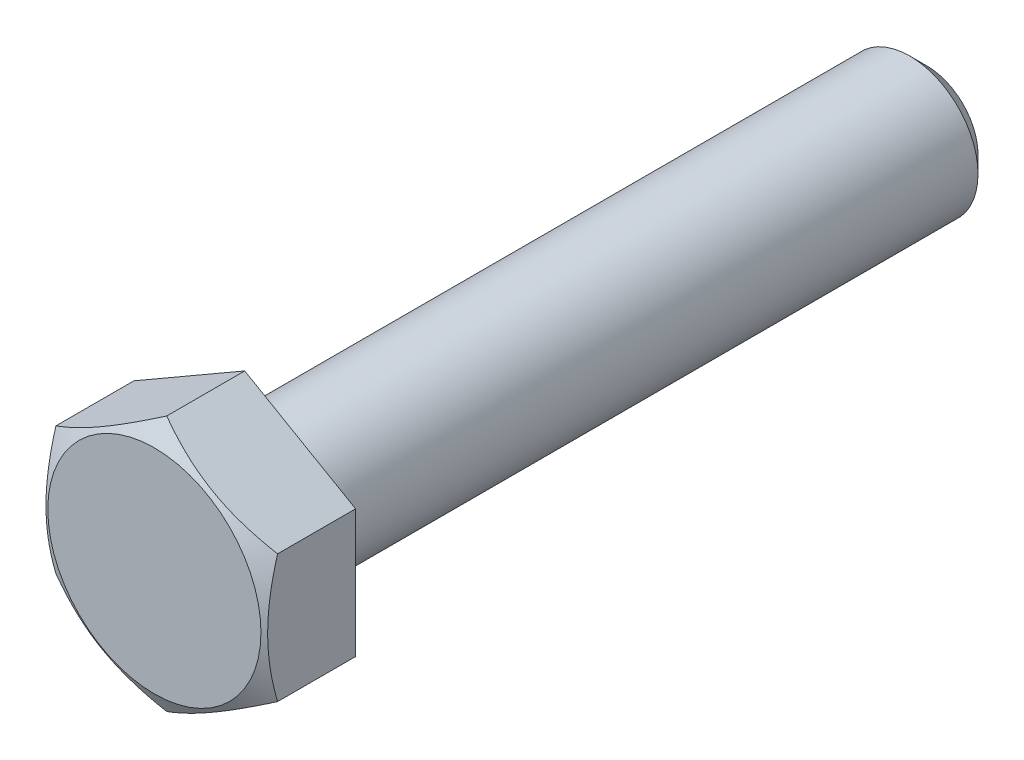
ISO-10303-21;
HEADER;
FILE_DESCRIPTION(('STEP AP214'),'2;1');
FILE_NAME('part.step','',(''),(''),'','','');
FILE_SCHEMA(('AUTOMOTIVE_DESIGN { 1 0 10303 214 1 1 1 1 }'));
ENDSEC;
DATA;
#1=APPLICATION_CONTEXT('core data for automotive mechanical design processes');
#2=APPLICATION_PROTOCOL_DEFINITION('international standard','automotive_design',2000,#1);
#3=PRODUCT_CONTEXT('',#1,'mechanical');
#4=PRODUCT('Part','Part','',(#3));
#5=PRODUCT_RELATED_PRODUCT_CATEGORY('part','',(#4));
#6=PRODUCT_DEFINITION_FORMATION('','',#4);
#7=PRODUCT_DEFINITION_CONTEXT('part definition',#1,'design');
#8=PRODUCT_DEFINITION('design','',#6,#7);
#9=PRODUCT_DEFINITION_SHAPE('','',#8);
#10=(LENGTH_UNIT() NAMED_UNIT(*) SI_UNIT(.MILLI.,.METRE.));
#11=(NAMED_UNIT(*) PLANE_ANGLE_UNIT() SI_UNIT($,.RADIAN.));
#12=(NAMED_UNIT(*) SI_UNIT($,.STERADIAN.) SOLID_ANGLE_UNIT());
#13=UNCERTAINTY_MEASURE_WITH_UNIT(LENGTH_MEASURE(1.E-05),#10,'distance_accuracy_value','');
#14=(GEOMETRIC_REPRESENTATION_CONTEXT(3) GLOBAL_UNCERTAINTY_ASSIGNED_CONTEXT((#13)) GLOBAL_UNIT_ASSIGNED_CONTEXT((#10,
#11,#12)) REPRESENTATION_CONTEXT('',''));
#15=CARTESIAN_POINT('',(0.,0.,0.));
#16=DIRECTION('',(0.,0.,1.));
#17=DIRECTION('',(1.,0.,0.));
#18=AXIS2_PLACEMENT_3D('',#15,#16,#17);
#19=CARTESIAN_POINT('',(6.5,3.75277674973257,5.3));
#20=DIRECTION('',(-0.5,-0.866025403784439,0.));
#21=DIRECTION('',(0.866025403784439,-0.5,0.));
#22=AXIS2_PLACEMENT_3D('',#19,#20,#21);
#23=PLANE('',#22);
#24=CARTESIAN_POINT('',(6.5002,3.75266127967873,4.57503918089673));
#25=CARTESIAN_POINT('',(6.35732254094112,3.8351516191275,4.62265800962711));
#26=CARTESIAN_POINT('',(6.21391236546508,3.91794952254312,4.66811573209989));
#27=CARTESIAN_POINT('',(5.9259273686828,4.08421773795795,4.75411375067955));
#28=CARTESIAN_POINT('',(5.78135207342873,4.16768832359105,4.79465192547457));
#29=CARTESIAN_POINT('',(5.34531134947996,4.41943655294051,4.90809143157939));
#30=CARTESIAN_POINT('',(5.05212471715368,4.5887079340369,4.97261462557386));
#31=CARTESIAN_POINT('',(4.61337625445562,4.84201947708215,5.0482758491551));
#32=CARTESIAN_POINT('',(4.46912536350531,4.92530276780316,5.06982957624561));
#33=CARTESIAN_POINT('',(4.17997178286191,5.09224566542477,5.10597211809648));
#34=CARTESIAN_POINT('',(4.03506915190111,5.17590523841627,5.12056154824293));
#35=CARTESIAN_POINT('',(3.74501222057168,5.34336968579964,5.14240368019525));
#36=CARTESIAN_POINT('',(3.59985839394579,5.427174286676,5.14966470838049));
#37=CARTESIAN_POINT('',(3.30942466302505,5.59485627940484,5.15670213012036));
#38=CARTESIAN_POINT('',(3.16414476276364,5.6787336689286,5.15647875489039));
#39=CARTESIAN_POINT('',(2.7661240575735,5.90853103021317,5.14557897418743));
#40=CARTESIAN_POINT('',(2.51351353897243,6.05437578112763,5.12728061483318));
#41=CARTESIAN_POINT('',(2.00997032176432,6.34509659313135,5.06925609124492));
#42=CARTESIAN_POINT('',(1.75903939406691,6.48997163178544,5.02951009416435));
#43=CARTESIAN_POINT('',(1.25448277935568,6.78127752911038,4.93015652950044));
#44=CARTESIAN_POINT('',(1.00092075856408,6.92767163007067,4.87012800706457));
#45=CARTESIAN_POINT('',(0.497578064240953,7.21827667013277,4.73388744019273));
#46=CARTESIAN_POINT('',(0.247790944447035,7.36249133098589,4.657707398539));
#47=CARTESIAN_POINT('',(-0.000200000000000559,7.50566896951897,4.57503918089673));
#48=B_SPLINE_CURVE_WITH_KNOTS('',3,(#24,#25,#26,#27,#28,#29,#30,#31,#32,#33,#34,#35,#36,#37,#38,
#39,#40,#41,#42,#43,#44,#45,#46,#47),.UNSPECIFIED.,.F.,.F.,(4,2,2,2,2,2,2,2,2,2,2,4),(0.,
0.515105052395587,1.03043143507524,2.06322554824262,2.56697389547996,3.07067772176454,
3.57380860368928,4.0769239424252,4.9527935470566,5.82947446853466,6.72559912449736,
7.61996451221045),.UNSPECIFIED.);
#49=CARTESIAN_POINT('',(6.5,3.75277674973257,4.57510584910183));
#50=VERTEX_POINT('',#49);
#51=CARTESIAN_POINT('',(0.,7.50555349946513,4.57510584910183));
#52=VERTEX_POINT('',#51);
#53=EDGE_CURVE('E94',#50,#52,#48,.T.);
#54=ORIENTED_EDGE('',*,*,#53,.F.);
#55=DIRECTION('',(0.,0.,-1.));
#56=VECTOR('',#55,1.);
#57=CARTESIAN_POINT('',(6.5,3.75277674973257,5.3));
#58=LINE('',#57,#56);
#59=CARTESIAN_POINT('',(6.5,3.75277674973257,0.));
#60=VERTEX_POINT('',#59);
#61=EDGE_CURVE('E63',#50,#60,#58,.T.);
#62=ORIENTED_EDGE('',*,*,#61,.T.);
#63=DIRECTION('',(-0.866025403784439,0.5,0.));
#64=VECTOR('',#63,1.);
#65=CARTESIAN_POINT('',(6.5,3.75277674973257,0.));
#66=LINE('',#65,#64);
#67=CARTESIAN_POINT('',(0.,7.50555349946513,0.));
#68=VERTEX_POINT('',#67);
#69=EDGE_CURVE('E102',#60,#68,#66,.T.);
#70=ORIENTED_EDGE('',*,*,#69,.T.);
#71=DIRECTION('',(0.,0.,-1.));
#72=VECTOR('',#71,1.);
#73=CARTESIAN_POINT('',(0.,7.50555349946513,5.3));
#74=LINE('',#73,#72);
#75=EDGE_CURVE('E101',#52,#68,#74,.T.);
#76=ORIENTED_EDGE('',*,*,#75,.F.);
#77=EDGE_LOOP('',(#54,#62,#70,#76));
#78=FACE_BOUND('',#77,.T.);
#79=ADVANCED_FACE('F40',(#78),#23,.F.);
#80=CARTESIAN_POINT('',(0.,7.50555349946513,5.3));
#81=DIRECTION('',(0.5,-0.866025403784439,0.));
#82=DIRECTION('',(0.866025403784439,0.5,0.));
#83=AXIS2_PLACEMENT_3D('',#80,#81,#82);
#84=PLANE('',#83);
#85=CARTESIAN_POINT('',(0.000199999999999772,7.50566896951897,4.57503918089673));
#86=CARTESIAN_POINT('',(-0.142677459058881,7.4231786300702,4.62265800962711));
#87=CARTESIAN_POINT('',(-0.286087634534913,7.34038072665458,4.66811573209989));
#88=CARTESIAN_POINT('',(-0.574072631317195,7.17411251123976,4.75411375067955));
#89=CARTESIAN_POINT('',(-0.718647926571264,7.09064192560665,4.79465192547457));
#90=CARTESIAN_POINT('',(-1.15468865052003,6.83889369625719,4.90809143157939));
#91=CARTESIAN_POINT('',(-1.44787528284632,6.66962231516081,4.97261462557386));
#92=CARTESIAN_POINT('',(-1.88662374554437,6.41631077211555,5.0482758491551));
#93=CARTESIAN_POINT('',(-2.03087463649469,6.33302748139454,5.06982957624561));
#94=CARTESIAN_POINT('',(-2.32002821713809,6.16608458377293,5.10597211809648));
#95=CARTESIAN_POINT('',(-2.46493084809889,6.08242501078143,5.12056154824293));
#96=CARTESIAN_POINT('',(-2.75498777942832,5.91496056339806,5.14240368019525));
#97=CARTESIAN_POINT('',(-2.90014160605421,5.8311559625217,5.14966470838049));
#98=CARTESIAN_POINT('',(-3.19057533697495,5.66347396979287,5.15670213012036));
#99=CARTESIAN_POINT('',(-3.33585523723636,5.5795965802691,5.15647875489039));
#100=CARTESIAN_POINT('',(-3.73387594242649,5.34979921898453,5.14557897418743));
#101=CARTESIAN_POINT('',(-3.98648646102757,5.20395446807007,5.12728061483318));
#102=CARTESIAN_POINT('',(-4.49002967823568,4.91323365606636,5.06925609124492));
#103=CARTESIAN_POINT('',(-4.74096060593308,4.76835861741226,5.02951009416435));
#104=CARTESIAN_POINT('',(-5.24551722064432,4.47705272008732,4.93015652950044));
#105=CARTESIAN_POINT('',(-5.49907924143591,4.33065861912703,4.87012800706457));
#106=CARTESIAN_POINT('',(-6.00242193575904,4.04005357906494,4.73388744019273));
#107=CARTESIAN_POINT('',(-6.25220905555296,3.89583891821182,4.657707398539));
#108=CARTESIAN_POINT('',(-6.5002,3.75266127967873,4.57503918089673));
#109=B_SPLINE_CURVE_WITH_KNOTS('',3,(#85,#86,#87,#88,#89,#90,#91,#92,#93,#94,#95,#96,#97,#98,
#99,#100,#101,#102,#103,#104,#105,#106,#107,#108),.UNSPECIFIED.,.F.,.F.,(4,2,2,2,2,2,2,2,2,2,2,
4),(0.,0.515105052395588,1.03043143507524,2.06322554824262,2.56697389547996,3.07067772176454,
3.57380860368928,4.0769239424252,4.9527935470566,5.82947446853466,6.72559912449736,
7.61996451221046),.UNSPECIFIED.);
#110=CARTESIAN_POINT('',(-6.5,3.75277674973257,4.57510584910183));
#111=VERTEX_POINT('',#110);
#112=EDGE_CURVE('E103',#52,#111,#109,.T.);
#113=ORIENTED_EDGE('',*,*,#112,.F.);
#114=ORIENTED_EDGE('',*,*,#75,.T.);
#115=DIRECTION('',(-0.866025403784439,-0.5,0.));
#116=VECTOR('',#115,1.);
#117=CARTESIAN_POINT('',(0.,7.50555349946513,0.));
#118=LINE('',#117,#116);
#119=CARTESIAN_POINT('',(-6.5,3.75277674973257,0.));
#120=VERTEX_POINT('',#119);
#121=EDGE_CURVE('E222',#68,#120,#118,.T.);
#122=ORIENTED_EDGE('',*,*,#121,.T.);
#123=DIRECTION('',(0.,0.,-1.));
#124=VECTOR('',#123,1.);
#125=CARTESIAN_POINT('',(-6.5,3.75277674973257,5.3));
#126=LINE('',#125,#124);
#127=EDGE_CURVE('E120',#111,#120,#126,.T.);
#128=ORIENTED_EDGE('',*,*,#127,.F.);
#129=EDGE_LOOP('',(#113,#114,#122,#128));
#130=FACE_BOUND('',#129,.T.);
#131=ADVANCED_FACE('F144',(#130),#84,.F.);
#132=CARTESIAN_POINT('',(-6.5,3.75277674973257,5.3));
#133=DIRECTION('',(1.,0.,0.));
#134=DIRECTION('',(0.,0.,-1.));
#135=AXIS2_PLACEMENT_3D('',#132,#133,#134);
#136=PLANE('',#135);
#137=CARTESIAN_POINT('',(-6.5,-10.1964031930489,1.92711557165721));
#138=CARTESIAN_POINT('',(-6.5,-9.91146706252512,2.06579754355137));
#139=CARTESIAN_POINT('',(-6.5,-9.62588907457074,2.20318274861047));
#140=CARTESIAN_POINT('',(-6.5,-9.05310840022942,2.47463240106079));
#141=CARTESIAN_POINT('',(-6.5,-8.76590547628142,2.60869634663158));
#142=CARTESIAN_POINT('',(-6.5,-8.18810963339234,2.87342586157266));
#143=CARTESIAN_POINT('',(-6.5,-7.89750683697914,3.00406994488669));
#144=CARTESIAN_POINT('',(-6.5,-7.31402958895834,3.26016311775927));
#145=CARTESIAN_POINT('',(-6.5,-7.02115524220785,3.38561244543842));
#146=CARTESIAN_POINT('',(-6.5,-6.42287342665227,3.63401536482613));
#147=CARTESIAN_POINT('',(-6.5,-6.11737326861938,3.75674689735945));
#148=CARTESIAN_POINT('',(-6.5,-5.50284186470128,3.99319880427273));
#149=CARTESIAN_POINT('',(-6.5,-5.19381023341625,4.10691818417453));
#150=CARTESIAN_POINT('',(-6.5,-4.57226679200279,4.32244612814773));
#151=CARTESIAN_POINT('',(-6.5,-4.25976307613069,4.4242778102538));
#152=CARTESIAN_POINT('',(-6.5,-3.63027121398134,4.61283895840874));
#153=CARTESIAN_POINT('',(-6.5,-3.31328447599402,4.69957305804761));
#154=CARTESIAN_POINT('',(-6.5,-2.67639712557225,4.85340222686151));
#155=CARTESIAN_POINT('',(-6.5,-2.3565229810901,4.92060515873457));
#156=CARTESIAN_POINT('',(-6.5,-1.71263332307702,5.03162587527321));
#157=CARTESIAN_POINT('',(-6.5,-1.38861825600943,5.07544615957369));
#158=CARTESIAN_POINT('',(-6.5,-0.90293972852367,5.12073543049099));
#159=CARTESIAN_POINT('',(-6.5,-0.742189550322453,5.13241333858599));
#160=CARTESIAN_POINT('',(-6.5,-0.420332063816456,5.14896113908469));
#161=CARTESIAN_POINT('',(-6.5,-0.259224761667658,5.15383114794059));
#162=CARTESIAN_POINT('',(-6.5,0.0630511216418176,5.15663919673593));
#163=CARTESIAN_POINT('',(-6.5,0.224219703305156,5.15457717853122));
#164=CARTESIAN_POINT('',(-6.5,0.546324268949108,5.14357483116284));
#165=CARTESIAN_POINT('',(-6.5,0.707260241688987,5.1346341800386));
#166=CARTESIAN_POINT('',(-6.5,1.09049506880968,5.10534524526755));
#167=CARTESIAN_POINT('',(-6.5,1.31256476986377,5.08193031415322));
#168=CARTESIAN_POINT('',(-6.5,1.75512160628943,5.02325347502964));
#169=CARTESIAN_POINT('',(-6.5,1.97560853645986,4.98799005825506));
#170=CARTESIAN_POINT('',(-6.5,2.63439856988161,4.86629161806814));
#171=CARTESIAN_POINT('',(-6.5,3.06980900545459,4.76396766778308));
#172=CARTESIAN_POINT('',(-6.5,3.72118788096864,4.58565121984061));
#173=CARTESIAN_POINT('',(-6.5,3.94050855697565,4.5211929338711));
#174=CARTESIAN_POINT('',(-6.5,4.37702114158928,4.38536743656224));
#175=CARTESIAN_POINT('',(-6.5,4.59421303390638,4.31400017240058));
#176=CARTESIAN_POINT('',(-6.5,5.02653508607764,4.1655196367425));
#177=CARTESIAN_POINT('',(-6.5,5.24166582474598,4.08840803513156));
#178=CARTESIAN_POINT('',(-6.5,5.67012789403292,3.92936761306644));
#179=CARTESIAN_POINT('',(-6.5,5.88345926514816,3.8474389013589));
#180=CARTESIAN_POINT('',(-6.5,6.45686419323843,3.62098197309385));
#181=CARTESIAN_POINT('',(-6.5,6.81544214889601,3.4726704145426));
#182=CARTESIAN_POINT('',(-6.5,7.52892619030864,3.16743287773286));
#183=CARTESIAN_POINT('',(-6.5,7.88383187065143,3.0105059601635));
#184=CARTESIAN_POINT('',(-6.5,8.59081374128433,2.69007555499517));
#185=CARTESIAN_POINT('',(-6.5,8.94288881107286,2.52656960336644));
#186=CARTESIAN_POINT('',(-6.5,9.64464600542362,2.19455308073868));
#187=CARTESIAN_POINT('',(-6.5,9.9943282251893,2.02604271028996));
#188=CARTESIAN_POINT('',(-6.5,10.6923270252369,1.68483568484166));
#189=CARTESIAN_POINT('',(-6.5,11.0406405627199,1.51213281824188));
#190=CARTESIAN_POINT('',(-6.5,11.7357056494374,1.16361011170295));
#191=CARTESIAN_POINT('',(-6.5,12.0824571858439,0.987790246223629));
#192=CARTESIAN_POINT('',(-6.5,12.7746015421308,0.633683743777883));
#193=CARTESIAN_POINT('',(-6.5,13.1199946416679,0.455397652787269));
#194=CARTESIAN_POINT('',(-6.5,13.8097189165945,0.0967819278551111));
#195=CARTESIAN_POINT('',(-6.5,14.1540500877756,-0.0835477141718704));
#196=CARTESIAN_POINT('',(-6.5,15.1131791649223,-0.588833427630172));
#197=CARTESIAN_POINT('',(-6.5,15.7270059152904,-0.915632545673792));
#198=CARTESIAN_POINT('',(-6.5,16.9526102543151,-1.57313126938156));
#199=CARTESIAN_POINT('',(-6.5,17.5643877160335,-1.90383111113284));
#200=CARTESIAN_POINT('',(-6.5,18.7843432470106,-2.56703187359179));
#201=CARTESIAN_POINT('',(-6.5,19.3925265283063,-2.89952321614154));
#202=CARTESIAN_POINT('',(-6.5,20.6076120788137,-3.56672759971615));
#203=CARTESIAN_POINT('',(-6.5,21.2145144440943,-3.90144046571286));
#204=CARTESIAN_POINT('',(-6.5,21.8209669709978,-4.23696051415545));
#205=B_SPLINE_CURVE_WITH_KNOTS('',3,(#137,#138,#139,#140,#141,#142,#143,#144,#145,#146,#147,
#148,#149,#150,#151,#152,#153,#154,#155,#156,#157,#158,#159,#160,#161,#162,#163,#164,#165,#166,
#167,#168,#169,#170,#171,#172,#173,#174,#175,#176,#177,#178,#179,#180,#181,#182,#183,#184,#185,
#186,#187,#188,#189,#190,#191,#192,#193,#194,#195,#196,#197,#198,#199,#200,#201,#202,#203,#204),
.UNSPECIFIED.,.F.,.F.,(4,2,2,2,2,2,2,2,2,2,2,2,2,2,2,2,2,2,2,2,2,2,2,2,2,2,2,2,2,2,2,2,2,4),(0.,
0.950690619419343,1.90152401651383,2.85733928389556,3.81311068938182,4.80069533328718,
5.78838880444144,6.77412832781171,7.75956478298498,8.73945089917041,9.71923224328163,
10.2026314085953,10.6860223050466,11.1694172560735,11.6528348342104,12.3223614428188,
12.9919733400987,14.3318623515428,15.0175917928263,15.7033264772407,16.3888625899154,
17.0743832324966,18.2383326098106,19.4024091425865,20.5669257879766,21.7313958285828,
22.8977114506331,24.0640366337077,25.2301076202752,26.3961832220869,28.4823609421224,
30.5686655804134,32.6480679984329,34.7273084857545),.UNSPECIFIED.);
#206=CARTESIAN_POINT('',(-6.5,-3.75277674973257,4.57510584910183));
#207=VERTEX_POINT('',#206);
#208=EDGE_CURVE('E196',#111,#207,#205,.F.);
#209=ORIENTED_EDGE('',*,*,#208,.F.);
#210=ORIENTED_EDGE('',*,*,#127,.T.);
#211=DIRECTION('',(0.,-1.,0.));
#212=VECTOR('',#211,1.);
#213=CARTESIAN_POINT('',(-6.5,3.75277674973257,0.));
#214=LINE('',#213,#212);
#215=CARTESIAN_POINT('',(-6.5,-3.75277674973257,0.));
#216=VERTEX_POINT('',#215);
#217=EDGE_CURVE('E223',#120,#216,#214,.T.);
#218=ORIENTED_EDGE('',*,*,#217,.T.);
#219=DIRECTION('',(0.,0.,-1.));
#220=VECTOR('',#219,1.);
#221=CARTESIAN_POINT('',(-6.5,-3.75277674973257,5.3));
#222=LINE('',#221,#220);
#223=EDGE_CURVE('E118',#207,#216,#222,.T.);
#224=ORIENTED_EDGE('',*,*,#223,.F.);
#225=EDGE_LOOP('',(#209,#210,#218,#224));
#226=FACE_BOUND('',#225,.T.);
#227=ADVANCED_FACE('F149',(#226),#136,.F.);
#228=CARTESIAN_POINT('',(-6.5,-3.75277674973257,5.3));
#229=DIRECTION('',(0.5,0.866025403784439,0.));
#230=DIRECTION('',(-0.866025403784439,0.5,0.));
#231=AXIS2_PLACEMENT_3D('',#228,#229,#230);
#232=PLANE('',#231);
#233=CARTESIAN_POINT('',(-6.5002,-3.75266127967873,4.57503918089673));
#234=CARTESIAN_POINT('',(-6.35732254094112,-3.8351516191275,4.62265800962711));
#235=CARTESIAN_POINT('',(-6.21391236546509,-3.91794952254312,4.66811573209989));
#236=CARTESIAN_POINT('',(-5.9259273686828,-4.08421773795795,4.75411375067955));
#237=CARTESIAN_POINT('',(-5.78135207342873,-4.16768832359105,4.79465192547457));
#238=CARTESIAN_POINT('',(-5.34531134947996,-4.41943655294051,4.90809143157939));
#239=CARTESIAN_POINT('',(-5.05212471715368,-4.5887079340369,4.97261462557386));
#240=CARTESIAN_POINT('',(-4.61337625445563,-4.84201947708215,5.0482758491551));
#241=CARTESIAN_POINT('',(-4.46912536350531,-4.92530276780316,5.06982957624561));
#242=CARTESIAN_POINT('',(-4.17997178286191,-5.09224566542477,5.10597211809648));
#243=CARTESIAN_POINT('',(-4.03506915190111,-5.17590523841627,5.12056154824293));
#244=CARTESIAN_POINT('',(-3.74501222057168,-5.34336968579964,5.14240368019525));
#245=CARTESIAN_POINT('',(-3.59985839394579,-5.427174286676,5.14966470838049));
#246=CARTESIAN_POINT('',(-3.30942466302505,-5.59485627940484,5.15670213012036));
#247=CARTESIAN_POINT('',(-3.16414476276364,-5.6787336689286,5.15647875489039));
#248=CARTESIAN_POINT('',(-2.76612405757351,-5.90853103021317,5.14557897418743));
#249=CARTESIAN_POINT('',(-2.51351353897243,-6.05437578112763,5.12728061483318));
#250=CARTESIAN_POINT('',(-2.00997032176432,-6.34509659313134,5.06925609124492));
#251=CARTESIAN_POINT('',(-1.75903939406692,-6.48997163178544,5.02951009416435));
#252=CARTESIAN_POINT('',(-1.25448277935568,-6.78127752911038,4.93015652950044));
#253=CARTESIAN_POINT('',(-1.00092075856409,-6.92767163007067,4.87012800706457));
#254=CARTESIAN_POINT('',(-0.497578064240957,-7.21827667013277,4.73388744019273));
#255=CARTESIAN_POINT('',(-0.247790944447038,-7.36249133098589,4.657707398539));
#256=CARTESIAN_POINT('',(0.000199999999997799,-7.50566896951897,4.57503918089673));
#257=B_SPLINE_CURVE_WITH_KNOTS('',3,(#233,#234,#235,#236,#237,#238,#239,#240,#241,#242,#243,
#244,#245,#246,#247,#248,#249,#250,#251,#252,#253,#254,#255,#256),.UNSPECIFIED.,.F.,.F.,(4,2,2,
2,2,2,2,2,2,2,2,4),(0.,0.515105052395587,1.03043143507524,2.06322554824262,2.56697389547996,
3.07067772176454,3.57380860368928,4.0769239424252,4.9527935470566,5.82947446853466,
6.72559912449736,7.61996451221045),.UNSPECIFIED.);
#258=CARTESIAN_POINT('',(0.,-7.50555349946513,4.57510584910183));
#259=VERTEX_POINT('',#258);
#260=EDGE_CURVE('E191',#207,#259,#257,.T.);
#261=ORIENTED_EDGE('',*,*,#260,.F.);
#262=ORIENTED_EDGE('',*,*,#223,.T.);
#263=DIRECTION('',(0.866025403784439,-0.5,0.));
#264=VECTOR('',#263,1.);
#265=CARTESIAN_POINT('',(-6.5,-3.75277674973257,0.));
#266=LINE('',#265,#264);
#267=CARTESIAN_POINT('',(0.,-7.50555349946513,0.));
#268=VERTEX_POINT('',#267);
#269=EDGE_CURVE('E226',#216,#268,#266,.T.);
#270=ORIENTED_EDGE('',*,*,#269,.T.);
#271=DIRECTION('',(0.,0.,-1.));
#272=VECTOR('',#271,1.);
#273=CARTESIAN_POINT('',(0.,-7.50555349946513,5.3));
#274=LINE('',#273,#272);
#275=EDGE_CURVE('E111',#259,#268,#274,.T.);
#276=ORIENTED_EDGE('',*,*,#275,.F.);
#277=EDGE_LOOP('',(#261,#262,#270,#276));
#278=FACE_BOUND('',#277,.T.);
#279=ADVANCED_FACE('F202',(#278),#232,.F.);
#280=CARTESIAN_POINT('',(0.,-7.50555349946513,5.3));
#281=DIRECTION('',(-0.5,0.866025403784439,0.));
#282=DIRECTION('',(-0.866025403784439,-0.5,0.));
#283=AXIS2_PLACEMENT_3D('',#280,#281,#282);
#284=PLANE('',#283);
#285=CARTESIAN_POINT('',(-0.000200000000002833,-7.50566896951897,4.57503918089673));
#286=CARTESIAN_POINT('',(0.142677459058877,-7.4231786300702,4.62265800962711));
#287=CARTESIAN_POINT('',(0.28608763453491,-7.34038072665458,4.66811573209989));
#288=CARTESIAN_POINT('',(0.574072631317192,-7.17411251123975,4.75411375067955));
#289=CARTESIAN_POINT('',(0.718647926571261,-7.09064192560665,4.79465192547457));
#290=CARTESIAN_POINT('',(1.15468865052003,-6.83889369625719,4.90809143157939));
#291=CARTESIAN_POINT('',(1.44787528284632,-6.66962231516081,4.97261462557386));
#292=CARTESIAN_POINT('',(1.88662374554437,-6.41631077211555,5.0482758491551));
#293=CARTESIAN_POINT('',(2.03087463649469,-6.33302748139454,5.06982957624561));
#294=CARTESIAN_POINT('',(2.32002821713809,-6.16608458377293,5.10597211809648));
#295=CARTESIAN_POINT('',(2.46493084809889,-6.08242501078143,5.12056154824293));
#296=CARTESIAN_POINT('',(2.75498777942832,-5.91496056339806,5.14240368019525));
#297=CARTESIAN_POINT('',(2.90014160605421,-5.8311559625217,5.14966470838049));
#298=CARTESIAN_POINT('',(3.19057533697495,-5.66347396979287,5.15670213012036));
#299=CARTESIAN_POINT('',(3.33585523723636,-5.5795965802691,5.15647875489039));
#300=CARTESIAN_POINT('',(3.73387594242649,-5.34979921898453,5.14557897418743));
#301=CARTESIAN_POINT('',(3.98648646102757,-5.20395446807007,5.12728061483318));
#302=CARTESIAN_POINT('',(4.49002967823568,-4.91323365606636,5.06925609124492));
#303=CARTESIAN_POINT('',(4.74096060593308,-4.76835861741226,5.02951009416435));
#304=CARTESIAN_POINT('',(5.24551722064432,-4.47705272008732,4.93015652950045));
#305=CARTESIAN_POINT('',(5.49907924143591,-4.33065861912703,4.87012800706457));
#306=CARTESIAN_POINT('',(6.00242193575904,-4.04005357906494,4.73388744019273));
#307=CARTESIAN_POINT('',(6.25220905555296,-3.89583891821182,4.657707398539));
#308=CARTESIAN_POINT('',(6.5002,-3.75266127967873,4.57503918089673));
#309=B_SPLINE_CURVE_WITH_KNOTS('',3,(#285,#286,#287,#288,#289,#290,#291,#292,#293,#294,#295,
#296,#297,#298,#299,#300,#301,#302,#303,#304,#305,#306,#307,#308),.UNSPECIFIED.,.F.,.F.,(4,2,2,
2,2,2,2,2,2,2,2,4),(0.,0.515105052395588,1.03043143507524,2.06322554824262,2.56697389547996,
3.07067772176454,3.57380860368928,4.0769239424252,4.9527935470566,5.82947446853466,
6.72559912449736,7.61996451221046),.UNSPECIFIED.);
#310=CARTESIAN_POINT('',(6.5,-3.75277674973257,4.57510584910183));
#311=VERTEX_POINT('',#310);
#312=EDGE_CURVE('E55',#259,#311,#309,.T.);
#313=ORIENTED_EDGE('',*,*,#312,.F.);
#314=ORIENTED_EDGE('',*,*,#275,.T.);
#315=DIRECTION('',(0.866025403784439,0.5,0.));
#316=VECTOR('',#315,1.);
#317=CARTESIAN_POINT('',(0.,-7.50555349946513,0.));
#318=LINE('',#317,#316);
#319=CARTESIAN_POINT('',(6.5,-3.75277674973257,0.));
#320=VERTEX_POINT('',#319);
#321=EDGE_CURVE('E113',#268,#320,#318,.T.);
#322=ORIENTED_EDGE('',*,*,#321,.T.);
#323=DIRECTION('',(0.,0.,-1.));
#324=VECTOR('',#323,1.);
#325=CARTESIAN_POINT('',(6.5,-3.75277674973257,5.3));
#326=LINE('',#325,#324);
#327=EDGE_CURVE('E109',#311,#320,#326,.T.);
#328=ORIENTED_EDGE('',*,*,#327,.F.);
#329=EDGE_LOOP('',(#313,#314,#322,#328));
#330=FACE_BOUND('',#329,.T.);
#331=ADVANCED_FACE('F206',(#330),#284,.F.);
#332=CARTESIAN_POINT('',(6.5,-3.75277674973257,5.3));
#333=DIRECTION('',(-1.,0.,0.));
#334=DIRECTION('',(0.,-1.,0.));
#335=AXIS2_PLACEMENT_3D('',#332,#333,#334);
#336=PLANE('',#335);
#337=CARTESIAN_POINT('',(6.5,-10.1964031963921,1.92711557002958));
#338=CARTESIAN_POINT('',(6.5,-9.91146706575583,2.06579754199164));
#339=CARTESIAN_POINT('',(6.5,-9.62588907768882,2.20318274711861));
#340=CARTESIAN_POINT('',(6.5,-9.05310840312192,2.47463239970435));
#341=CARTESIAN_POINT('',(6.5,-8.76590547906097,2.60869634534268));
#342=CARTESIAN_POINT('',(6.5,-8.18810963594424,2.87342586041888));
#343=CARTESIAN_POINT('',(6.5,-7.89750683941635,3.00406994380048));
#344=CARTESIAN_POINT('',(6.5,-7.31402959116539,3.26016311680708));
#345=CARTESIAN_POINT('',(6.5,-7.02115524429944,3.38561244455269));
#346=CARTESIAN_POINT('',(6.5,-6.42287342850399,3.63401536407521));
#347=CARTESIAN_POINT('',(6.5,-6.11737327034664,3.75674689667674));
#348=CARTESIAN_POINT('',(6.5,-5.50284186617759,3.99319880372282));
#349=CARTESIAN_POINT('',(6.5,-5.19381023476609,4.1069181836892));
#350=CARTESIAN_POINT('',(6.5,-4.57226679309735,4.3224461277854));
#351=CARTESIAN_POINT('',(6.5,-4.25976307709645,4.42427780994992));
#352=CARTESIAN_POINT('',(6.5,-3.63027121468599,4.61283895821224));
#353=CARTESIAN_POINT('',(6.5,-3.31328447656636,4.69957305790006));
#354=CARTESIAN_POINT('',(6.5,-2.67639712581227,4.85340222681279));
#355=CARTESIAN_POINT('',(6.5,-2.35652298112919,4.92060515873196));
#356=CARTESIAN_POINT('',(6.5,-1.71263332270929,5.0316258753325));
#357=CARTESIAN_POINT('',(6.5,-1.3886182554358,5.07544615964879));
#358=CARTESIAN_POINT('',(6.5,-0.902939727642646,5.12073543056245));
#359=CARTESIAN_POINT('',(6.5,-0.742189549340452,5.13241333865179));
#360=CARTESIAN_POINT('',(6.5,-0.420332062632674,5.14896113913027));
#361=CARTESIAN_POINT('',(6.5,-0.259224760383073,5.15383114797159));
#362=CARTESIAN_POINT('',(6.5,0.0630511231272613,5.15663919672905));
#363=CARTESIAN_POINT('',(6.5,0.224219704890654,5.15457717850103));
#364=CARTESIAN_POINT('',(6.5,0.546324270733419,5.14357483107791));
#365=CARTESIAN_POINT('',(6.5,0.707260243572055,5.13463417992224));
#366=CARTESIAN_POINT('',(6.5,1.09049507084486,5.1053452450739));
#367=CARTESIAN_POINT('',(6.5,1.31256477195186,5.08193031391512));
#368=CARTESIAN_POINT('',(6.5,1.75512160848097,5.02325347470026));
#369=CARTESIAN_POINT('',(6.5,1.97560853870191,4.98799005787886));
#370=CARTESIAN_POINT('',(6.5,2.63439857227244,4.8662916175505));
#371=CARTESIAN_POINT('',(6.5,3.06980900794069,4.76396766716991));
#372=CARTESIAN_POINT('',(6.5,3.72118788359726,4.58565121908648));
#373=CARTESIAN_POINT('',(6.5,3.94050855965281,4.52119293306965));
#374=CARTESIAN_POINT('',(6.5,4.37702114436295,4.38536743566762));
#375=CARTESIAN_POINT('',(6.5,4.59421303672804,4.3140001714601));
#376=CARTESIAN_POINT('',(6.5,5.02653508899492,4.16551963571194));
#377=CARTESIAN_POINT('',(6.5,5.24166582771088,4.08840803405679));
#378=CARTESIAN_POINT('',(6.5,5.67012789709309,3.9293676119048));
#379=CARTESIAN_POINT('',(6.5,5.88345926825596,3.8474389001546));
#380=CARTESIAN_POINT('',(6.5,6.45686419637332,3.62098197181646));
#381=CARTESIAN_POINT('',(6.5,6.81544215201176,3.4726704132394));
#382=CARTESIAN_POINT('',(6.5,7.52892619338857,3.16743287638554));
#383=CARTESIAN_POINT('',(6.5,7.88383187371468,3.01050595879786));
#384=CARTESIAN_POINT('',(6.5,8.59081374431601,2.69007555359836));
#385=CARTESIAN_POINT('',(6.5,8.94288881408965,2.52656960195676));
#386=CARTESIAN_POINT('',(6.5,9.64464600841221,2.19455307930711));
#387=CARTESIAN_POINT('',(6.5,9.9943282281646,2.02604270884935));
#388=CARTESIAN_POINT('',(6.5,10.692327028186,1.68483568338619));
#389=CARTESIAN_POINT('',(6.5,11.0406405656562,1.51213281678058));
#390=CARTESIAN_POINT('',(6.5,11.7357056523488,1.16361011023212));
#391=CARTESIAN_POINT('',(6.5,12.0824571887433,0.987790244749081));
#392=CARTESIAN_POINT('',(6.5,12.7746015450073,0.633683742297424));
#393=CARTESIAN_POINT('',(6.49999999999999,13.1199946445333,0.455397651304614));
#394=CARTESIAN_POINT('',(6.49999999999999,13.8097189194384,0.0967819263692756));
#395=CARTESIAN_POINT('',(6.49999999999999,14.154050090609,-0.0835477156586897));
#396=CARTESIAN_POINT('',(6.49999999999999,15.113179167745,-0.588833429127821));
#397=CARTESIAN_POINT('',(6.49999999999999,15.7270059181133,-0.915632547180414));
#398=CARTESIAN_POINT('',(6.49999999999999,16.9526102571392,-1.57313127090433));
#399=CARTESIAN_POINT('',(6.49999999999999,17.5643877188586,-1.9038311126628));
#400=CARTESIAN_POINT('',(6.49999999999999,18.7843432498413,-2.56703187513649));
#401=CARTESIAN_POINT('',(6.49999999999999,19.3925265311416,-2.89952321769382));
#402=CARTESIAN_POINT('',(6.49999999999999,20.6076120816587,-3.56672760128277));
#403=CARTESIAN_POINT('',(6.49999999999999,21.2145144469444,-3.90144046728626));
#404=CARTESIAN_POINT('',(6.49999999999999,21.8209669738531,-4.23696051573536));
#405=B_SPLINE_CURVE_WITH_KNOTS('',3,(#337,#338,#339,#340,#341,#342,#343,#344,#345,#346,#347,
#348,#349,#350,#351,#352,#353,#354,#355,#356,#357,#358,#359,#360,#361,#362,#363,#364,#365,#366,
#367,#368,#369,#370,#371,#372,#373,#374,#375,#376,#377,#378,#379,#380,#381,#382,#383,#384,#385,
#386,#387,#388,#389,#390,#391,#392,#393,#394,#395,#396,#397,#398,#399,#400,#401,#402,#403,#404),
.UNSPECIFIED.,.F.,.F.,(4,2,2,2,2,2,2,2,2,2,2,2,2,2,2,2,2,2,2,2,2,2,2,2,2,2,2,2,2,2,2,2,2,4),(0.,
0.950690619812072,1.90152401729934,2.85733928507801,3.81311069096117,4.80069533528928,
5.78838880686643,6.7741283306582,7.75956478625263,8.73945090305517,9.71923224778258,
10.2026314133969,10.6860223101489,11.1694172614765,11.6528348399143,12.3223614486944,
12.9919733461461,14.3318623579345,15.0175917993978,15.703326483992,16.388862596846,
17.0743832396065,18.2383326168974,19.4024091496498,20.5669257950157,21.7313958355979,
22.8977114576212,24.064036640669,25.23010762721,26.3961832289953,28.482360949044,
30.5686655873478,32.6480680053903,34.7273084927351),.UNSPECIFIED.);
#406=EDGE_CURVE('E92',#311,#50,#405,.T.);
#407=ORIENTED_EDGE('',*,*,#406,.F.);
#408=ORIENTED_EDGE('',*,*,#327,.T.);
#409=DIRECTION('',(0.,1.,0.));
#410=VECTOR('',#409,1.);
#411=CARTESIAN_POINT('',(6.5,-3.75277674973257,0.));
#412=LINE('',#411,#410);
#413=EDGE_CURVE('E107',#320,#60,#412,.T.);
#414=ORIENTED_EDGE('',*,*,#413,.T.);
#415=ORIENTED_EDGE('',*,*,#61,.F.);
#416=EDGE_LOOP('',(#407,#408,#414,#415));
#417=FACE_BOUND('',#416,.T.);
#418=ADVANCED_FACE('F105',(#417),#336,.F.);
#419=CARTESIAN_POINT('',(0.,0.,0.));
#420=DIRECTION('',(0.,0.,1.));
#421=DIRECTION('',(1.,0.,0.));
#422=AXIS2_PLACEMENT_3D('',#419,#420,#421);
#423=PLANE('',#422);
#424=CARTESIAN_POINT('',(0.,0.,0.));
#425=DIRECTION('',(0.,0.,1.));
#426=DIRECTION('',(1.,0.,0.));
#427=AXIS2_PLACEMENT_3D('',#424,#425,#426);
#428=CIRCLE('',#427,4.5);
#429=CARTESIAN_POINT('',(4.5,0.,0.));
#430=VERTEX_POINT('',#429);
#431=EDGE_CURVE('E12',#430,#430,#428,.T.);
#432=ORIENTED_EDGE('',*,*,#431,.T.);
#433=EDGE_LOOP('',(#432));
#434=FACE_BOUND('',#433,.T.);
#435=ORIENTED_EDGE('',*,*,#69,.F.);
#436=ORIENTED_EDGE('',*,*,#413,.F.);
#437=ORIENTED_EDGE('',*,*,#321,.F.);
#438=ORIENTED_EDGE('',*,*,#269,.F.);
#439=ORIENTED_EDGE('',*,*,#217,.F.);
#440=ORIENTED_EDGE('',*,*,#121,.F.);
#441=EDGE_LOOP('',(#435,#436,#437,#438,#439,#440));
#442=FACE_BOUND('',#441,.T.);
#443=ADVANCED_FACE('F171',(#434,#442),#423,.F.);
#444=CARTESIAN_POINT('',(0.,0.,5.3));
#445=DIRECTION('',(0.,0.,-1.));
#446=DIRECTION('',(1.,0.,0.));
#447=AXIS2_PLACEMENT_3D('',#444,#445,#446);
#448=CONICAL_SURFACE('',#447,6.25,1.0471975511966);
#449=CARTESIAN_POINT('',(0.,0.,5.3));
#450=DIRECTION('',(0.,0.,1.));
#451=DIRECTION('',(1.,0.,0.));
#452=AXIS2_PLACEMENT_3D('',#449,#450,#451);
#453=CIRCLE('',#452,6.25);
#454=CARTESIAN_POINT('',(6.25,0.,5.3));
#455=VERTEX_POINT('',#454);
#456=EDGE_CURVE('E98',#455,#455,#453,.T.);
#457=ORIENTED_EDGE('',*,*,#456,.F.);
#458=EDGE_LOOP('',(#457));
#459=FACE_BOUND('',#458,.T.);
#460=ORIENTED_EDGE('',*,*,#53,.T.);
#461=ORIENTED_EDGE('',*,*,#112,.T.);
#462=ORIENTED_EDGE('',*,*,#208,.T.);
#463=ORIENTED_EDGE('',*,*,#260,.T.);
#464=ORIENTED_EDGE('',*,*,#312,.T.);
#465=ORIENTED_EDGE('',*,*,#406,.T.);
#466=EDGE_LOOP('',(#460,#461,#462,#463,#464,#465));
#467=FACE_BOUND('',#466,.T.);
#468=ADVANCED_FACE('F93',(#459,#467),#448,.T.);
#469=CARTESIAN_POINT('',(0.,0.,5.3));
#470=DIRECTION('',(0.,0.,1.));
#471=DIRECTION('',(1.,0.,0.));
#472=AXIS2_PLACEMENT_3D('',#469,#470,#471);
#473=PLANE('',#472);
#474=ORIENTED_EDGE('',*,*,#456,.T.);
#475=EDGE_LOOP('',(#474));
#476=FACE_BOUND('',#475,.T.);
#477=ADVANCED_FACE('F170',(#476),#473,.T.);
#478=CARTESIAN_POINT('',(0.,0.,-40.));
#479=DIRECTION('',(0.,0.,1.));
#480=DIRECTION('',(1.,0.,0.));
#481=AXIS2_PLACEMENT_3D('',#478,#479,#480);
#482=CYLINDRICAL_SURFACE('',#481,4.);
#483=CARTESIAN_POINT('',(0.,0.,-0.5));
#484=DIRECTION('',(0.,0.,1.));
#485=DIRECTION('',(1.,0.,0.));
#486=AXIS2_PLACEMENT_3D('',#483,#484,#485);
#487=CIRCLE('',#486,4.);
#488=CARTESIAN_POINT('',(4.,0.,-0.5));
#489=VERTEX_POINT('',#488);
#490=EDGE_CURVE('E48',#489,#489,#487,.F.);
#491=ORIENTED_EDGE('',*,*,#490,.T.);
#492=EDGE_LOOP('',(#491));
#493=FACE_BOUND('',#492,.T.);
#494=CARTESIAN_POINT('',(0.,0.,-39.));
#495=DIRECTION('',(0.,0.,-1.));
#496=DIRECTION('',(-1.,0.,0.));
#497=AXIS2_PLACEMENT_3D('',#494,#495,#496);
#498=CIRCLE('',#497,4.);
#499=CARTESIAN_POINT('',(-4.,0.,-39.));
#500=VERTEX_POINT('',#499);
#501=EDGE_CURVE('E126',#500,#500,#498,.F.);
#502=ORIENTED_EDGE('',*,*,#501,.T.);
#503=EDGE_LOOP('',(#502));
#504=FACE_BOUND('',#503,.T.);
#505=ADVANCED_FACE('F131',(#493,#504),#482,.T.);
#506=CARTESIAN_POINT('',(0.,0.,-40.));
#507=DIRECTION('',(0.,0.,-1.));
#508=DIRECTION('',(-1.,0.,0.));
#509=AXIS2_PLACEMENT_3D('',#506,#507,#508);
#510=PLANE('',#509);
#511=CARTESIAN_POINT('',(0.,0.,-40.));
#512=DIRECTION('',(0.,0.,-1.));
#513=DIRECTION('',(-1.,0.,0.));
#514=AXIS2_PLACEMENT_3D('',#511,#512,#513);
#515=CIRCLE('',#514,3.);
#516=CARTESIAN_POINT('',(-3.,0.,-40.));
#517=VERTEX_POINT('',#516);
#518=EDGE_CURVE('E123',#517,#517,#515,.T.);
#519=ORIENTED_EDGE('',*,*,#518,.T.);
#520=EDGE_LOOP('',(#519));
#521=FACE_BOUND('',#520,.T.);
#522=ADVANCED_FACE('F140',(#521),#510,.T.);
#523=CARTESIAN_POINT('',(0.,0.,-40.));
#524=DIRECTION('',(0.,0.,1.));
#525=DIRECTION('',(1.,0.,0.));
#526=AXIS2_PLACEMENT_3D('',#523,#524,#525);
#527=CONICAL_SURFACE('',#526,3.,0.785398163397447);
#528=ORIENTED_EDGE('',*,*,#501,.F.);
#529=EDGE_LOOP('',(#528));
#530=FACE_BOUND('',#529,.T.);
#531=ORIENTED_EDGE('',*,*,#518,.F.);
#532=EDGE_LOOP('',(#531));
#533=FACE_BOUND('',#532,.T.);
#534=ADVANCED_FACE('F135',(#530,#533),#527,.T.);
#535=CARTESIAN_POINT('',(0.,0.,-0.5));
#536=DIRECTION('',(0.,0.,1.));
#537=DIRECTION('',(1.,0.,0.));
#538=AXIS2_PLACEMENT_3D('',#535,#536,#537);
#539=TOROIDAL_SURFACE('',#538,4.5,0.5);
#540=ORIENTED_EDGE('',*,*,#431,.F.);
#541=EDGE_LOOP('',(#540));
#542=FACE_BOUND('',#541,.T.);
#543=ORIENTED_EDGE('',*,*,#490,.F.);
#544=EDGE_LOOP('',(#543));
#545=FACE_BOUND('',#544,.T.);
#546=ADVANCED_FACE('F42',(#542,#545),#539,.F.);
#547=CLOSED_SHELL('',(#79,#131,#227,#279,#331,#418,#443,#468,#477,#505,#522,#534,#546));
#548=MANIFOLD_SOLID_BREP('B2',#547);
#549=ADVANCED_BREP_SHAPE_REPRESENTATION('',(#18,#548),#14);
#550=SHAPE_DEFINITION_REPRESENTATION(#9,#549);
ENDSEC;
END-ISO-10303-21;
